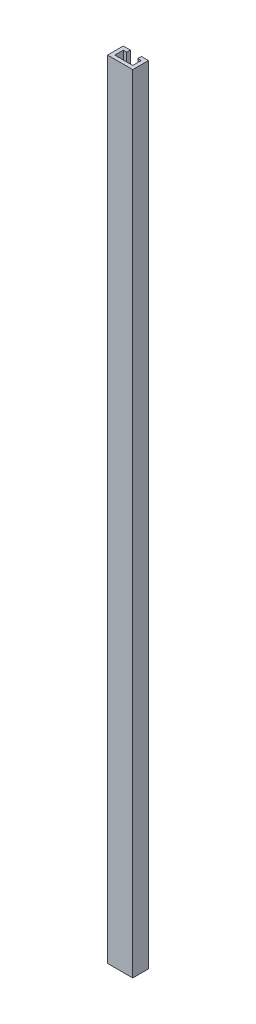
ISO-10303-21;
HEADER;
FILE_DESCRIPTION(('STEP AP214'),'2;1');
FILE_NAME('part.step','',(''),(''),'','','');
FILE_SCHEMA(('AUTOMOTIVE_DESIGN { 1 0 10303 214 1 1 1 1 }'));
ENDSEC;
DATA;
#1=APPLICATION_CONTEXT('core data for automotive mechanical design processes');
#2=APPLICATION_PROTOCOL_DEFINITION('international standard','automotive_design',2000,#1);
#3=PRODUCT_CONTEXT('',#1,'mechanical');
#4=PRODUCT('Part','Part','',(#3));
#5=PRODUCT_RELATED_PRODUCT_CATEGORY('part','',(#4));
#6=PRODUCT_DEFINITION_FORMATION('','',#4);
#7=PRODUCT_DEFINITION_CONTEXT('part definition',#1,'design');
#8=PRODUCT_DEFINITION('design','',#6,#7);
#9=PRODUCT_DEFINITION_SHAPE('','',#8);
#10=(LENGTH_UNIT() NAMED_UNIT(*) SI_UNIT(.MILLI.,.METRE.));
#11=(NAMED_UNIT(*) PLANE_ANGLE_UNIT() SI_UNIT($,.RADIAN.));
#12=(NAMED_UNIT(*) SI_UNIT($,.STERADIAN.) SOLID_ANGLE_UNIT());
#13=UNCERTAINTY_MEASURE_WITH_UNIT(LENGTH_MEASURE(1.E-05),#10,'distance_accuracy_value','');
#14=(GEOMETRIC_REPRESENTATION_CONTEXT(3) GLOBAL_UNCERTAINTY_ASSIGNED_CONTEXT((#13)) GLOBAL_UNIT_ASSIGNED_CONTEXT((#10,
#11,#12)) REPRESENTATION_CONTEXT('',''));
#15=CARTESIAN_POINT('',(0.,0.,0.));
#16=DIRECTION('',(0.,0.,1.));
#17=DIRECTION('',(1.,0.,0.));
#18=AXIS2_PLACEMENT_3D('',#15,#16,#17);
#19=CARTESIAN_POINT('',(0.,250.,0.));
#20=DIRECTION('',(1.,0.,0.));
#21=DIRECTION('',(0.,0.,-1.));
#22=AXIS2_PLACEMENT_3D('',#19,#20,#21);
#23=PLANE('',#22);
#24=DIRECTION('',(0.,0.,1.));
#25=VECTOR('',#24,1.);
#26=CARTESIAN_POINT('',(0.,0.,0.));
#27=LINE('',#26,#25);
#28=CARTESIAN_POINT('',(0.,0.,0.));
#29=VERTEX_POINT('',#28);
#30=CARTESIAN_POINT('',(0.,0.,5.));
#31=VERTEX_POINT('',#30);
#32=EDGE_CURVE('E164',#29,#31,#27,.T.);
#33=ORIENTED_EDGE('',*,*,#32,.T.);
#34=DIRECTION('',(0.,-1.,0.));
#35=VECTOR('',#34,1.);
#36=CARTESIAN_POINT('',(0.,250.,5.));
#37=LINE('',#36,#35);
#38=CARTESIAN_POINT('',(0.,250.,5.));
#39=VERTEX_POINT('',#38);
#40=EDGE_CURVE('E11',#39,#31,#37,.T.);
#41=ORIENTED_EDGE('',*,*,#40,.F.);
#42=DIRECTION('',(0.,0.,1.));
#43=VECTOR('',#42,1.);
#44=CARTESIAN_POINT('',(0.,250.,0.));
#45=LINE('',#44,#43);
#46=CARTESIAN_POINT('',(0.,250.,0.));
#47=VERTEX_POINT('',#46);
#48=EDGE_CURVE('E198',#47,#39,#45,.T.);
#49=ORIENTED_EDGE('',*,*,#48,.F.);
#50=DIRECTION('',(0.,-1.,0.));
#51=VECTOR('',#50,1.);
#52=CARTESIAN_POINT('',(0.,250.,0.));
#53=LINE('',#52,#51);
#54=EDGE_CURVE('E160',#47,#29,#53,.T.);
#55=ORIENTED_EDGE('',*,*,#54,.T.);
#56=EDGE_LOOP('',(#33,#41,#49,#55));
#57=FACE_BOUND('',#56,.T.);
#58=ADVANCED_FACE('F39',(#57),#23,.F.);
#59=CARTESIAN_POINT('',(0.,250.,5.));
#60=DIRECTION('',(0.,0.,-1.));
#61=DIRECTION('',(-1.,0.,0.));
#62=AXIS2_PLACEMENT_3D('',#59,#60,#61);
#63=PLANE('',#62);
#64=DIRECTION('',(1.,0.,0.));
#65=VECTOR('',#64,1.);
#66=CARTESIAN_POINT('',(0.,0.,5.));
#67=LINE('',#66,#65);
#68=CARTESIAN_POINT('',(8.,0.,5.));
#69=VERTEX_POINT('',#68);
#70=EDGE_CURVE('E168',#31,#69,#67,.T.);
#71=ORIENTED_EDGE('',*,*,#70,.T.);
#72=DIRECTION('',(0.,-1.,0.));
#73=VECTOR('',#72,1.);
#74=CARTESIAN_POINT('',(8.,250.,5.));
#75=LINE('',#74,#73);
#76=CARTESIAN_POINT('',(8.,250.,5.));
#77=VERTEX_POINT('',#76);
#78=EDGE_CURVE('E48',#77,#69,#75,.T.);
#79=ORIENTED_EDGE('',*,*,#78,.F.);
#80=DIRECTION('',(1.,0.,0.));
#81=VECTOR('',#80,1.);
#82=CARTESIAN_POINT('',(0.,250.,5.));
#83=LINE('',#82,#81);
#84=EDGE_CURVE('E111',#39,#77,#83,.T.);
#85=ORIENTED_EDGE('',*,*,#84,.F.);
#86=ORIENTED_EDGE('',*,*,#40,.T.);
#87=EDGE_LOOP('',(#71,#79,#85,#86));
#88=FACE_BOUND('',#87,.T.);
#89=ADVANCED_FACE('F292',(#88),#63,.F.);
#90=CARTESIAN_POINT('',(8.,250.,5.));
#91=DIRECTION('',(-1.,0.,0.));
#92=DIRECTION('',(0.,0.,1.));
#93=AXIS2_PLACEMENT_3D('',#90,#91,#92);
#94=PLANE('',#93);
#95=DIRECTION('',(0.,0.,-1.));
#96=VECTOR('',#95,1.);
#97=CARTESIAN_POINT('',(8.,0.,5.));
#98=LINE('',#97,#96);
#99=CARTESIAN_POINT('',(8.,0.,0.));
#100=VERTEX_POINT('',#99);
#101=EDGE_CURVE('E171',#69,#100,#98,.T.);
#102=ORIENTED_EDGE('',*,*,#101,.T.);
#103=DIRECTION('',(0.,-1.,0.));
#104=VECTOR('',#103,1.);
#105=CARTESIAN_POINT('',(8.,250.,0.));
#106=LINE('',#105,#104);
#107=CARTESIAN_POINT('',(8.,250.,0.));
#108=VERTEX_POINT('',#107);
#109=EDGE_CURVE('E225',#108,#100,#106,.T.);
#110=ORIENTED_EDGE('',*,*,#109,.F.);
#111=DIRECTION('',(0.,0.,-1.));
#112=VECTOR('',#111,1.);
#113=CARTESIAN_POINT('',(8.,250.,5.));
#114=LINE('',#113,#112);
#115=EDGE_CURVE('E235',#77,#108,#114,.T.);
#116=ORIENTED_EDGE('',*,*,#115,.F.);
#117=ORIENTED_EDGE('',*,*,#78,.T.);
#118=EDGE_LOOP('',(#102,#110,#116,#117));
#119=FACE_BOUND('',#118,.T.);
#120=ADVANCED_FACE('F233',(#119),#94,.F.);
#121=CARTESIAN_POINT('',(8.,250.,0.));
#122=DIRECTION('',(0.,0.,1.));
#123=DIRECTION('',(1.,0.,0.));
#124=AXIS2_PLACEMENT_3D('',#121,#122,#123);
#125=PLANE('',#124);
#126=DIRECTION('',(-1.,0.,0.));
#127=VECTOR('',#126,1.);
#128=CARTESIAN_POINT('',(8.,0.,0.));
#129=LINE('',#128,#127);
#130=CARTESIAN_POINT('',(5.75,0.,0.));
#131=VERTEX_POINT('',#130);
#132=EDGE_CURVE('E174',#100,#131,#129,.T.);
#133=ORIENTED_EDGE('',*,*,#132,.T.);
#134=DIRECTION('',(0.,-1.,0.));
#135=VECTOR('',#134,1.);
#136=CARTESIAN_POINT('',(5.75,250.,0.));
#137=LINE('',#136,#135);
#138=CARTESIAN_POINT('',(5.75,250.,0.));
#139=VERTEX_POINT('',#138);
#140=EDGE_CURVE('E221',#139,#131,#137,.T.);
#141=ORIENTED_EDGE('',*,*,#140,.F.);
#142=DIRECTION('',(-1.,0.,0.));
#143=VECTOR('',#142,1.);
#144=CARTESIAN_POINT('',(8.,250.,0.));
#145=LINE('',#144,#143);
#146=EDGE_CURVE('E254',#108,#139,#145,.T.);
#147=ORIENTED_EDGE('',*,*,#146,.F.);
#148=ORIENTED_EDGE('',*,*,#109,.T.);
#149=EDGE_LOOP('',(#133,#141,#147,#148));
#150=FACE_BOUND('',#149,.T.);
#151=ADVANCED_FACE('F244',(#150),#125,.F.);
#152=CARTESIAN_POINT('',(5.75,250.,0.));
#153=DIRECTION('',(1.,0.,0.));
#154=DIRECTION('',(0.,0.,-1.));
#155=AXIS2_PLACEMENT_3D('',#152,#153,#154);
#156=PLANE('',#155);
#157=DIRECTION('',(0.,0.,1.));
#158=VECTOR('',#157,1.);
#159=CARTESIAN_POINT('',(5.75,0.,0.));
#160=LINE('',#159,#158);
#161=CARTESIAN_POINT('',(5.75,0.,1.15));
#162=VERTEX_POINT('',#161);
#163=EDGE_CURVE('E177',#131,#162,#160,.T.);
#164=ORIENTED_EDGE('',*,*,#163,.T.);
#165=DIRECTION('',(0.,-1.,0.));
#166=VECTOR('',#165,1.);
#167=CARTESIAN_POINT('',(5.75,250.,1.15));
#168=LINE('',#167,#166);
#169=CARTESIAN_POINT('',(5.75,250.,1.15));
#170=VERTEX_POINT('',#169);
#171=EDGE_CURVE('E217',#170,#162,#168,.T.);
#172=ORIENTED_EDGE('',*,*,#171,.F.);
#173=DIRECTION('',(0.,0.,1.));
#174=VECTOR('',#173,1.);
#175=CARTESIAN_POINT('',(5.75,250.,0.));
#176=LINE('',#175,#174);
#177=EDGE_CURVE('E250',#139,#170,#176,.T.);
#178=ORIENTED_EDGE('',*,*,#177,.F.);
#179=ORIENTED_EDGE('',*,*,#140,.T.);
#180=EDGE_LOOP('',(#164,#172,#178,#179));
#181=FACE_BOUND('',#180,.T.);
#182=ADVANCED_FACE('F248',(#181),#156,.F.);
#183=CARTESIAN_POINT('',(5.75,250.,1.15));
#184=DIRECTION('',(0.,0.,-1.));
#185=DIRECTION('',(-1.,0.,0.));
#186=AXIS2_PLACEMENT_3D('',#183,#184,#185);
#187=PLANE('',#186);
#188=DIRECTION('',(1.,0.,0.));
#189=VECTOR('',#188,1.);
#190=CARTESIAN_POINT('',(5.75,0.,1.15));
#191=LINE('',#190,#189);
#192=CARTESIAN_POINT('',(6.85,0.,1.15));
#193=VERTEX_POINT('',#192);
#194=EDGE_CURVE('E180',#162,#193,#191,.T.);
#195=ORIENTED_EDGE('',*,*,#194,.T.);
#196=DIRECTION('',(0.,-1.,0.));
#197=VECTOR('',#196,1.);
#198=CARTESIAN_POINT('',(6.85,250.,1.15));
#199=LINE('',#198,#197);
#200=CARTESIAN_POINT('',(6.85,250.,1.15));
#201=VERTEX_POINT('',#200);
#202=EDGE_CURVE('E213',#201,#193,#199,.T.);
#203=ORIENTED_EDGE('',*,*,#202,.F.);
#204=DIRECTION('',(1.,0.,0.));
#205=VECTOR('',#204,1.);
#206=CARTESIAN_POINT('',(5.75,250.,1.15));
#207=LINE('',#206,#205);
#208=EDGE_CURVE('E253',#170,#201,#207,.T.);
#209=ORIENTED_EDGE('',*,*,#208,.F.);
#210=ORIENTED_EDGE('',*,*,#171,.T.);
#211=EDGE_LOOP('',(#195,#203,#209,#210));
#212=FACE_BOUND('',#211,.T.);
#213=ADVANCED_FACE('F305',(#212),#187,.F.);
#214=CARTESIAN_POINT('',(6.85,250.,1.15));
#215=DIRECTION('',(1.,0.,0.));
#216=DIRECTION('',(0.,0.,-1.));
#217=AXIS2_PLACEMENT_3D('',#214,#215,#216);
#218=PLANE('',#217);
#219=DIRECTION('',(0.,0.,1.));
#220=VECTOR('',#219,1.);
#221=CARTESIAN_POINT('',(6.85,0.,1.15));
#222=LINE('',#221,#220);
#223=CARTESIAN_POINT('',(6.85,0.,3.85));
#224=VERTEX_POINT('',#223);
#225=EDGE_CURVE('E183',#193,#224,#222,.T.);
#226=ORIENTED_EDGE('',*,*,#225,.T.);
#227=DIRECTION('',(0.,-1.,0.));
#228=VECTOR('',#227,1.);
#229=CARTESIAN_POINT('',(6.85,250.,3.85));
#230=LINE('',#229,#228);
#231=CARTESIAN_POINT('',(6.85,250.,3.85));
#232=VERTEX_POINT('',#231);
#233=EDGE_CURVE('E209',#232,#224,#230,.T.);
#234=ORIENTED_EDGE('',*,*,#233,.F.);
#235=DIRECTION('',(0.,0.,1.));
#236=VECTOR('',#235,1.);
#237=CARTESIAN_POINT('',(6.85,250.,1.15));
#238=LINE('',#237,#236);
#239=EDGE_CURVE('E258',#201,#232,#238,.T.);
#240=ORIENTED_EDGE('',*,*,#239,.F.);
#241=ORIENTED_EDGE('',*,*,#202,.T.);
#242=EDGE_LOOP('',(#226,#234,#240,#241));
#243=FACE_BOUND('',#242,.T.);
#244=ADVANCED_FACE('F308',(#243),#218,.F.);
#245=CARTESIAN_POINT('',(6.85,250.,3.85));
#246=DIRECTION('',(0.,0.,1.));
#247=DIRECTION('',(1.,0.,0.));
#248=AXIS2_PLACEMENT_3D('',#245,#246,#247);
#249=PLANE('',#248);
#250=DIRECTION('',(-1.,0.,0.));
#251=VECTOR('',#250,1.);
#252=CARTESIAN_POINT('',(6.85,0.,3.85));
#253=LINE('',#252,#251);
#254=CARTESIAN_POINT('',(1.15,0.,3.85));
#255=VERTEX_POINT('',#254);
#256=EDGE_CURVE('E186',#224,#255,#253,.T.);
#257=ORIENTED_EDGE('',*,*,#256,.T.);
#258=DIRECTION('',(0.,-1.,0.));
#259=VECTOR('',#258,1.);
#260=CARTESIAN_POINT('',(1.15,250.,3.85));
#261=LINE('',#260,#259);
#262=CARTESIAN_POINT('',(1.15,250.,3.85));
#263=VERTEX_POINT('',#262);
#264=EDGE_CURVE('E205',#263,#255,#261,.T.);
#265=ORIENTED_EDGE('',*,*,#264,.F.);
#266=DIRECTION('',(-1.,0.,0.));
#267=VECTOR('',#266,1.);
#268=CARTESIAN_POINT('',(6.85,250.,3.85));
#269=LINE('',#268,#267);
#270=EDGE_CURVE('E265',#232,#263,#269,.T.);
#271=ORIENTED_EDGE('',*,*,#270,.F.);
#272=ORIENTED_EDGE('',*,*,#233,.T.);
#273=EDGE_LOOP('',(#257,#265,#271,#272));
#274=FACE_BOUND('',#273,.T.);
#275=ADVANCED_FACE('F273',(#274),#249,.F.);
#276=CARTESIAN_POINT('',(1.15,250.,3.85));
#277=DIRECTION('',(-1.,0.,0.));
#278=DIRECTION('',(0.,0.,1.));
#279=AXIS2_PLACEMENT_3D('',#276,#277,#278);
#280=PLANE('',#279);
#281=DIRECTION('',(0.,0.,-1.));
#282=VECTOR('',#281,1.);
#283=CARTESIAN_POINT('',(1.15,0.,3.85));
#284=LINE('',#283,#282);
#285=CARTESIAN_POINT('',(1.15,0.,1.15));
#286=VERTEX_POINT('',#285);
#287=EDGE_CURVE('E189',#255,#286,#284,.T.);
#288=ORIENTED_EDGE('',*,*,#287,.T.);
#289=DIRECTION('',(0.,-1.,0.));
#290=VECTOR('',#289,1.);
#291=CARTESIAN_POINT('',(1.15,250.,1.15));
#292=LINE('',#291,#290);
#293=CARTESIAN_POINT('',(1.15,250.,1.15));
#294=VERTEX_POINT('',#293);
#295=EDGE_CURVE('E153',#294,#286,#292,.T.);
#296=ORIENTED_EDGE('',*,*,#295,.F.);
#297=DIRECTION('',(0.,0.,-1.));
#298=VECTOR('',#297,1.);
#299=CARTESIAN_POINT('',(1.15,250.,3.85));
#300=LINE('',#299,#298);
#301=EDGE_CURVE('E142',#263,#294,#300,.T.);
#302=ORIENTED_EDGE('',*,*,#301,.F.);
#303=ORIENTED_EDGE('',*,*,#264,.T.);
#304=EDGE_LOOP('',(#288,#296,#302,#303));
#305=FACE_BOUND('',#304,.T.);
#306=ADVANCED_FACE('F277',(#305),#280,.F.);
#307=CARTESIAN_POINT('',(1.15,250.,1.15));
#308=DIRECTION('',(0.,0.,-1.));
#309=DIRECTION('',(-1.,0.,0.));
#310=AXIS2_PLACEMENT_3D('',#307,#308,#309);
#311=PLANE('',#310);
#312=DIRECTION('',(1.,0.,0.));
#313=VECTOR('',#312,1.);
#314=CARTESIAN_POINT('',(1.15,0.,1.15));
#315=LINE('',#314,#313);
#316=CARTESIAN_POINT('',(2.25,0.,1.15));
#317=VERTEX_POINT('',#316);
#318=EDGE_CURVE('E151',#286,#317,#315,.T.);
#319=ORIENTED_EDGE('',*,*,#318,.T.);
#320=DIRECTION('',(0.,-1.,0.));
#321=VECTOR('',#320,1.);
#322=CARTESIAN_POINT('',(2.25,250.,1.15));
#323=LINE('',#322,#321);
#324=CARTESIAN_POINT('',(2.25,250.,1.15));
#325=VERTEX_POINT('',#324);
#326=EDGE_CURVE('E148',#325,#317,#323,.T.);
#327=ORIENTED_EDGE('',*,*,#326,.F.);
#328=DIRECTION('',(1.,0.,0.));
#329=VECTOR('',#328,1.);
#330=CARTESIAN_POINT('',(1.15,250.,1.15));
#331=LINE('',#330,#329);
#332=EDGE_CURVE('E136',#294,#325,#331,.T.);
#333=ORIENTED_EDGE('',*,*,#332,.F.);
#334=ORIENTED_EDGE('',*,*,#295,.T.);
#335=EDGE_LOOP('',(#319,#327,#333,#334));
#336=FACE_BOUND('',#335,.T.);
#337=ADVANCED_FACE('F149',(#336),#311,.F.);
#338=CARTESIAN_POINT('',(2.25,250.,1.15));
#339=DIRECTION('',(-1.,0.,0.));
#340=DIRECTION('',(0.,0.,1.));
#341=AXIS2_PLACEMENT_3D('',#338,#339,#340);
#342=PLANE('',#341);
#343=DIRECTION('',(0.,0.,-1.));
#344=VECTOR('',#343,1.);
#345=CARTESIAN_POINT('',(2.25,0.,1.15));
#346=LINE('',#345,#344);
#347=CARTESIAN_POINT('',(2.25,0.,0.));
#348=VERTEX_POINT('',#347);
#349=EDGE_CURVE('E97',#317,#348,#346,.T.);
#350=ORIENTED_EDGE('',*,*,#349,.T.);
#351=DIRECTION('',(0.,-1.,0.));
#352=VECTOR('',#351,1.);
#353=CARTESIAN_POINT('',(2.25,250.,0.));
#354=LINE('',#353,#352);
#355=CARTESIAN_POINT('',(2.25,250.,0.));
#356=VERTEX_POINT('',#355);
#357=EDGE_CURVE('E154',#356,#348,#354,.T.);
#358=ORIENTED_EDGE('',*,*,#357,.F.);
#359=DIRECTION('',(0.,0.,-1.));
#360=VECTOR('',#359,1.);
#361=CARTESIAN_POINT('',(2.25,250.,1.15));
#362=LINE('',#361,#360);
#363=EDGE_CURVE('E140',#325,#356,#362,.T.);
#364=ORIENTED_EDGE('',*,*,#363,.F.);
#365=ORIENTED_EDGE('',*,*,#326,.T.);
#366=EDGE_LOOP('',(#350,#358,#364,#365));
#367=FACE_BOUND('',#366,.T.);
#368=ADVANCED_FACE('F156',(#367),#342,.F.);
#369=CARTESIAN_POINT('',(2.25,250.,0.));
#370=DIRECTION('',(0.,0.,1.));
#371=DIRECTION('',(1.,0.,0.));
#372=AXIS2_PLACEMENT_3D('',#369,#370,#371);
#373=PLANE('',#372);
#374=DIRECTION('',(-1.,0.,0.));
#375=VECTOR('',#374,1.);
#376=CARTESIAN_POINT('',(2.25,0.,0.));
#377=LINE('',#376,#375);
#378=EDGE_CURVE('E103',#348,#29,#377,.T.);
#379=ORIENTED_EDGE('',*,*,#378,.T.);
#380=ORIENTED_EDGE('',*,*,#54,.F.);
#381=DIRECTION('',(-1.,0.,0.));
#382=VECTOR('',#381,1.);
#383=CARTESIAN_POINT('',(2.25,250.,0.));
#384=LINE('',#383,#382);
#385=EDGE_CURVE('E56',#356,#47,#384,.T.);
#386=ORIENTED_EDGE('',*,*,#385,.F.);
#387=ORIENTED_EDGE('',*,*,#357,.T.);
#388=EDGE_LOOP('',(#379,#380,#386,#387));
#389=FACE_BOUND('',#388,.T.);
#390=ADVANCED_FACE('F281',(#389),#373,.F.);
#391=CARTESIAN_POINT('',(0.,250.,0.));
#392=DIRECTION('',(0.,1.,0.));
#393=DIRECTION('',(0.,0.,1.));
#394=AXIS2_PLACEMENT_3D('',#391,#392,#393);
#395=PLANE('',#394);
#396=ORIENTED_EDGE('',*,*,#48,.T.);
#397=ORIENTED_EDGE('',*,*,#84,.T.);
#398=ORIENTED_EDGE('',*,*,#115,.T.);
#399=ORIENTED_EDGE('',*,*,#146,.T.);
#400=ORIENTED_EDGE('',*,*,#177,.T.);
#401=ORIENTED_EDGE('',*,*,#208,.T.);
#402=ORIENTED_EDGE('',*,*,#239,.T.);
#403=ORIENTED_EDGE('',*,*,#270,.T.);
#404=ORIENTED_EDGE('',*,*,#301,.T.);
#405=ORIENTED_EDGE('',*,*,#332,.T.);
#406=ORIENTED_EDGE('',*,*,#363,.T.);
#407=ORIENTED_EDGE('',*,*,#385,.T.);
#408=EDGE_LOOP('',(#396,#397,#398,#399,#400,#401,#402,#403,#404,#405,#406,#407));
#409=FACE_BOUND('',#408,.T.);
#410=ADVANCED_FACE('F138',(#409),#395,.T.);
#411=CARTESIAN_POINT('',(0.,0.,0.));
#412=DIRECTION('',(0.,1.,0.));
#413=DIRECTION('',(0.,0.,1.));
#414=AXIS2_PLACEMENT_3D('',#411,#412,#413);
#415=PLANE('',#414);
#416=ORIENTED_EDGE('',*,*,#32,.F.);
#417=ORIENTED_EDGE('',*,*,#378,.F.);
#418=ORIENTED_EDGE('',*,*,#349,.F.);
#419=ORIENTED_EDGE('',*,*,#318,.F.);
#420=ORIENTED_EDGE('',*,*,#287,.F.);
#421=ORIENTED_EDGE('',*,*,#256,.F.);
#422=ORIENTED_EDGE('',*,*,#225,.F.);
#423=ORIENTED_EDGE('',*,*,#194,.F.);
#424=ORIENTED_EDGE('',*,*,#163,.F.);
#425=ORIENTED_EDGE('',*,*,#132,.F.);
#426=ORIENTED_EDGE('',*,*,#101,.F.);
#427=ORIENTED_EDGE('',*,*,#70,.F.);
#428=EDGE_LOOP('',(#416,#417,#418,#419,#420,#421,#422,#423,#424,#425,#426,#427));
#429=FACE_BOUND('',#428,.T.);
#430=ADVANCED_FACE('F239',(#429),#415,.F.);
#431=CLOSED_SHELL('',(#58,#89,#120,#151,#182,#213,#244,#275,#306,#337,#368,#390,#410,#430));
#432=MANIFOLD_SOLID_BREP('B2',#431);
#433=ADVANCED_BREP_SHAPE_REPRESENTATION('',(#18,#432),#14);
#434=SHAPE_DEFINITION_REPRESENTATION(#9,#433);
ENDSEC;
END-ISO-10303-21;
